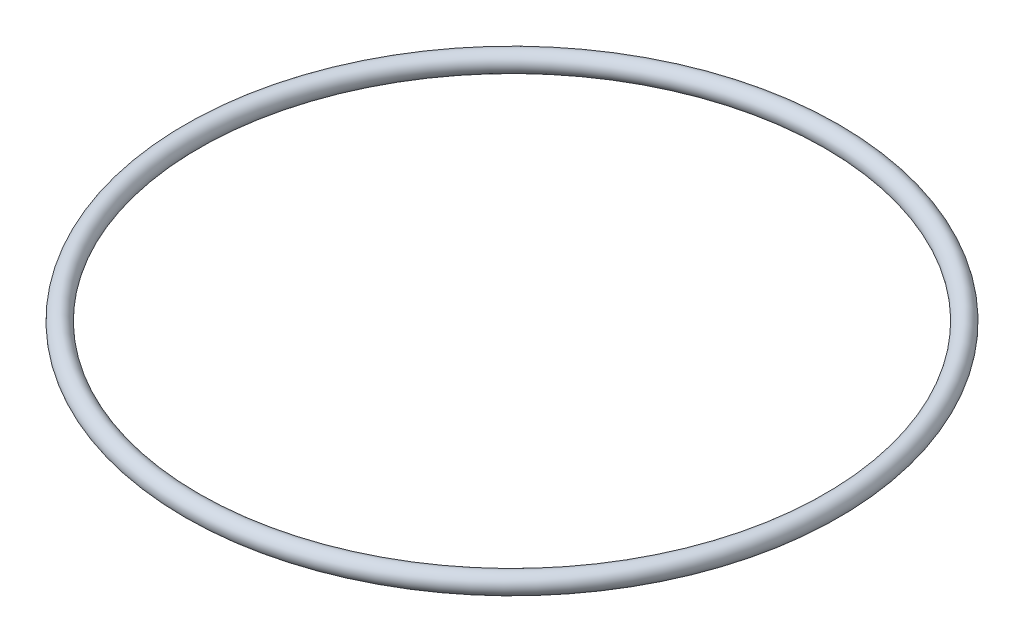
ISO-10303-21;
HEADER;
FILE_DESCRIPTION(('STEP AP214'),'2;1');
FILE_NAME('part.step','',(''),(''),'','','');
FILE_SCHEMA(('AUTOMOTIVE_DESIGN { 1 0 10303 214 1 1 1 1 }'));
ENDSEC;
DATA;
#1=APPLICATION_CONTEXT('core data for automotive mechanical design processes');
#2=APPLICATION_PROTOCOL_DEFINITION('international standard','automotive_design',2000,#1);
#3=PRODUCT_CONTEXT('',#1,'mechanical');
#4=PRODUCT('Part','Part','',(#3));
#5=PRODUCT_RELATED_PRODUCT_CATEGORY('part','',(#4));
#6=PRODUCT_DEFINITION_FORMATION('','',#4);
#7=PRODUCT_DEFINITION_CONTEXT('part definition',#1,'design');
#8=PRODUCT_DEFINITION('design','',#6,#7);
#9=PRODUCT_DEFINITION_SHAPE('','',#8);
#10=(LENGTH_UNIT() NAMED_UNIT(*) SI_UNIT(.MILLI.,.METRE.));
#11=(NAMED_UNIT(*) PLANE_ANGLE_UNIT() SI_UNIT($,.RADIAN.));
#12=(NAMED_UNIT(*) SI_UNIT($,.STERADIAN.) SOLID_ANGLE_UNIT());
#13=UNCERTAINTY_MEASURE_WITH_UNIT(LENGTH_MEASURE(1.E-05),#10,'distance_accuracy_value','');
#14=(GEOMETRIC_REPRESENTATION_CONTEXT(3) GLOBAL_UNCERTAINTY_ASSIGNED_CONTEXT((#13)) GLOBAL_UNIT_ASSIGNED_CONTEXT((#10,
#11,#12)) REPRESENTATION_CONTEXT('',''));
#15=CARTESIAN_POINT('',(0.,0.,0.));
#16=DIRECTION('',(0.,0.,1.));
#17=DIRECTION('',(1.,0.,0.));
#18=AXIS2_PLACEMENT_3D('',#15,#16,#17);
#19=CARTESIAN_POINT('',(0.,0.,0.));
#20=DIRECTION('',(0.,1.,0.));
#21=DIRECTION('',(0.,0.,1.));
#22=AXIS2_PLACEMENT_3D('',#19,#20,#21);
#23=TOROIDAL_SURFACE('',#22,16.5,0.5);
#24=CARTESIAN_POINT('',(0.,0.,16.5));
#25=DIRECTION('',(1.,0.,0.));
#26=DIRECTION('',(0.,0.,-1.));
#27=AXIS2_PLACEMENT_3D('',#24,#25,#26);
#28=CIRCLE('',#27,0.5);
#29=CARTESIAN_POINT('',(0.,0.,17.));
#30=VERTEX_POINT('',#29);
#31=EDGE_CURVE('E11',#30,#30,#28,.T.);
#32=CARTESIAN_POINT('',(0.,0.,0.));
#33=DIRECTION('',(0.,1.,0.));
#34=DIRECTION('',(0.,0.,1.));
#35=AXIS2_PLACEMENT_3D('',#32,#33,#34);
#36=CIRCLE('',#35,17.);
#37=EDGE_CURVE('',#30,#30,#36,.T.);
#38=ORIENTED_EDGE('',*,*,#31,.T.);
#39=ORIENTED_EDGE('',*,*,#31,.F.);
#40=ORIENTED_EDGE('',*,*,#37,.T.);
#41=ORIENTED_EDGE('',*,*,#37,.F.);
#42=EDGE_LOOP('',(#38,#40,#39,#41));
#43=FACE_BOUND('',#42,.T.);
#44=ADVANCED_FACE('F50',(#43),#23,.T.);
#45=CLOSED_SHELL('',(#44));
#46=MANIFOLD_SOLID_BREP('B2',#45);
#47=ADVANCED_BREP_SHAPE_REPRESENTATION('',(#18,#46),#14);
#48=SHAPE_DEFINITION_REPRESENTATION(#9,#47);
ENDSEC;
END-ISO-10303-21;
